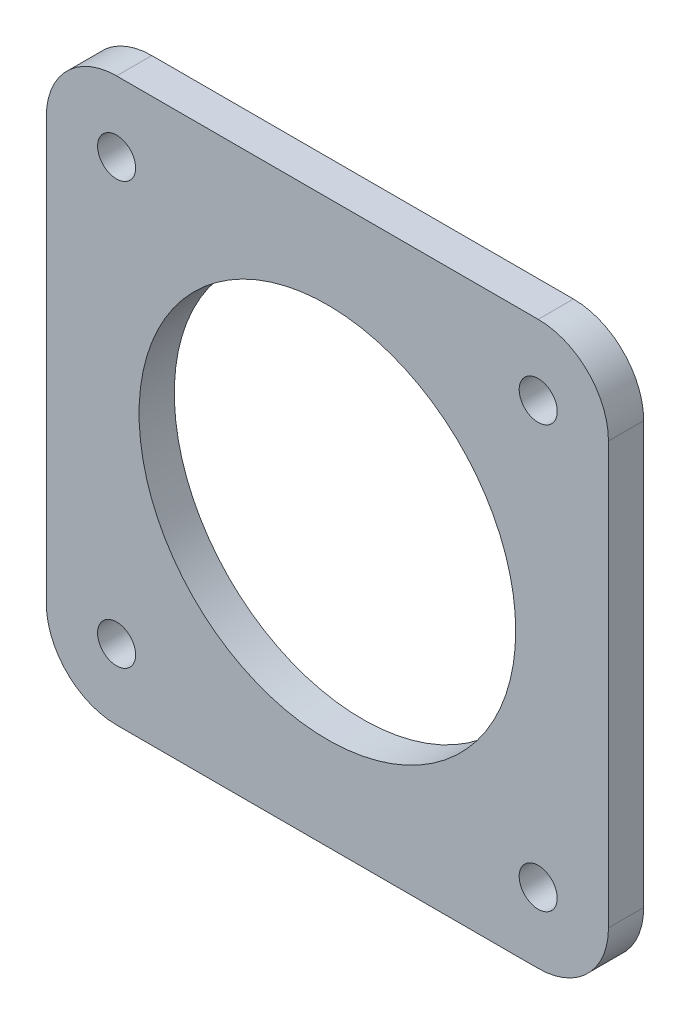
ISO-10303-21;
HEADER;
FILE_DESCRIPTION(('STEP AP214'),'2;1');
FILE_NAME('part.step','',(''),(''),'','','');
FILE_SCHEMA(('AUTOMOTIVE_DESIGN { 1 0 10303 214 1 1 1 1 }'));
ENDSEC;
DATA;
#1=APPLICATION_CONTEXT('core data for automotive mechanical design processes');
#2=APPLICATION_PROTOCOL_DEFINITION('international standard','automotive_design',2000,#1);
#3=PRODUCT_CONTEXT('',#1,'mechanical');
#4=PRODUCT('Part','Part','',(#3));
#5=PRODUCT_RELATED_PRODUCT_CATEGORY('part','',(#4));
#6=PRODUCT_DEFINITION_FORMATION('','',#4);
#7=PRODUCT_DEFINITION_CONTEXT('part definition',#1,'design');
#8=PRODUCT_DEFINITION('design','',#6,#7);
#9=PRODUCT_DEFINITION_SHAPE('','',#8);
#10=(LENGTH_UNIT() NAMED_UNIT(*) SI_UNIT(.MILLI.,.METRE.));
#11=(NAMED_UNIT(*) PLANE_ANGLE_UNIT() SI_UNIT($,.RADIAN.));
#12=(NAMED_UNIT(*) SI_UNIT($,.STERADIAN.) SOLID_ANGLE_UNIT());
#13=UNCERTAINTY_MEASURE_WITH_UNIT(LENGTH_MEASURE(1.E-05),#10,'distance_accuracy_value','');
#14=(GEOMETRIC_REPRESENTATION_CONTEXT(3) GLOBAL_UNCERTAINTY_ASSIGNED_CONTEXT((#13)) GLOBAL_UNIT_ASSIGNED_CONTEXT((#10,
#11,#12)) REPRESENTATION_CONTEXT('',''));
#15=CARTESIAN_POINT('',(0.,0.,0.));
#16=DIRECTION('',(0.,0.,1.));
#17=DIRECTION('',(1.,0.,0.));
#18=AXIS2_PLACEMENT_3D('',#15,#16,#17);
#19=CARTESIAN_POINT('',(28.575,28.575,-4.7752));
#20=DIRECTION('',(0.,0.,1.));
#21=DIRECTION('',(1.,0.,0.));
#22=AXIS2_PLACEMENT_3D('',#19,#20,#21);
#23=CYLINDRICAL_SURFACE('',#22,9.52500000000001);
#24=CARTESIAN_POINT('',(28.575,28.575,0.));
#25=DIRECTION('',(0.,0.,1.));
#26=DIRECTION('',(-1.,0.,0.));
#27=AXIS2_PLACEMENT_3D('',#24,#25,#26);
#28=CIRCLE('',#27,9.52500000000001);
#29=CARTESIAN_POINT('',(38.1,28.575,0.));
#30=VERTEX_POINT('',#29);
#31=CARTESIAN_POINT('',(28.575,38.1,0.));
#32=VERTEX_POINT('',#31);
#33=EDGE_CURVE('E131',#30,#32,#28,.T.);
#34=ORIENTED_EDGE('',*,*,#33,.F.);
#35=DIRECTION('',(0.,0.,1.));
#36=VECTOR('',#35,1.);
#37=CARTESIAN_POINT('',(38.1,28.575,-4.7752));
#38=LINE('',#37,#36);
#39=CARTESIAN_POINT('',(38.1,28.575,-4.7752));
#40=VERTEX_POINT('',#39);
#41=EDGE_CURVE('E11',#40,#30,#38,.T.);
#42=ORIENTED_EDGE('',*,*,#41,.F.);
#43=CARTESIAN_POINT('',(28.575,28.575,-4.7752));
#44=DIRECTION('',(0.,0.,1.));
#45=DIRECTION('',(-1.,0.,0.));
#46=AXIS2_PLACEMENT_3D('',#43,#44,#45);
#47=CIRCLE('',#46,9.52500000000001);
#48=CARTESIAN_POINT('',(28.575,38.1,-4.7752));
#49=VERTEX_POINT('',#48);
#50=EDGE_CURVE('E152',#40,#49,#47,.T.);
#51=ORIENTED_EDGE('',*,*,#50,.T.);
#52=DIRECTION('',(0.,0.,1.));
#53=VECTOR('',#52,1.);
#54=CARTESIAN_POINT('',(28.575,38.1,-4.7752));
#55=LINE('',#54,#53);
#56=EDGE_CURVE('E35',#49,#32,#55,.T.);
#57=ORIENTED_EDGE('',*,*,#56,.T.);
#58=EDGE_LOOP('',(#34,#42,#51,#57));
#59=FACE_BOUND('',#58,.T.);
#60=ADVANCED_FACE('F32',(#59),#23,.T.);
#61=CARTESIAN_POINT('',(38.1,28.575,-4.7752));
#62=DIRECTION('',(1.,0.,0.));
#63=DIRECTION('',(0.,0.,-1.));
#64=AXIS2_PLACEMENT_3D('',#61,#62,#63);
#65=PLANE('',#64);
#66=DIRECTION('',(0.,1.,0.));
#67=VECTOR('',#66,1.);
#68=CARTESIAN_POINT('',(38.1,28.575,0.));
#69=LINE('',#68,#67);
#70=CARTESIAN_POINT('',(38.1,-28.575,0.));
#71=VERTEX_POINT('',#70);
#72=EDGE_CURVE('E150',#71,#30,#69,.T.);
#73=ORIENTED_EDGE('',*,*,#72,.F.);
#74=DIRECTION('',(0.,0.,1.));
#75=VECTOR('',#74,1.);
#76=CARTESIAN_POINT('',(38.1,-28.575,-4.7752));
#77=LINE('',#76,#75);
#78=CARTESIAN_POINT('',(38.1,-28.575,-4.7752));
#79=VERTEX_POINT('',#78);
#80=EDGE_CURVE('E41',#79,#71,#77,.T.);
#81=ORIENTED_EDGE('',*,*,#80,.F.);
#82=DIRECTION('',(0.,1.,0.));
#83=VECTOR('',#82,1.);
#84=CARTESIAN_POINT('',(38.1,28.575,-4.7752));
#85=LINE('',#84,#83);
#86=EDGE_CURVE('E119',#79,#40,#85,.T.);
#87=ORIENTED_EDGE('',*,*,#86,.T.);
#88=ORIENTED_EDGE('',*,*,#41,.T.);
#89=EDGE_LOOP('',(#73,#81,#87,#88));
#90=FACE_BOUND('',#89,.T.);
#91=ADVANCED_FACE('F164',(#90),#65,.T.);
#92=CARTESIAN_POINT('',(28.575,-28.575,-4.7752));
#93=DIRECTION('',(0.,0.,1.));
#94=DIRECTION('',(1.,0.,0.));
#95=AXIS2_PLACEMENT_3D('',#92,#93,#94);
#96=CYLINDRICAL_SURFACE('',#95,9.52500000000001);
#97=CARTESIAN_POINT('',(28.575,-28.575,0.));
#98=DIRECTION('',(0.,0.,1.));
#99=DIRECTION('',(1.,0.,0.));
#100=AXIS2_PLACEMENT_3D('',#97,#98,#99);
#101=CIRCLE('',#100,9.52500000000001);
#102=CARTESIAN_POINT('',(28.575,-38.1,0.));
#103=VERTEX_POINT('',#102);
#104=EDGE_CURVE('E106',#103,#71,#101,.T.);
#105=ORIENTED_EDGE('',*,*,#104,.F.);
#106=DIRECTION('',(0.,0.,1.));
#107=VECTOR('',#106,1.);
#108=CARTESIAN_POINT('',(28.575,-38.1,-4.7752));
#109=LINE('',#108,#107);
#110=CARTESIAN_POINT('',(28.575,-38.1,-4.7752));
#111=VERTEX_POINT('',#110);
#112=EDGE_CURVE('E101',#111,#103,#109,.T.);
#113=ORIENTED_EDGE('',*,*,#112,.F.);
#114=CARTESIAN_POINT('',(28.575,-28.575,-4.7752));
#115=DIRECTION('',(0.,0.,1.));
#116=DIRECTION('',(1.,0.,0.));
#117=AXIS2_PLACEMENT_3D('',#114,#115,#116);
#118=CIRCLE('',#117,9.52500000000001);
#119=EDGE_CURVE('E104',#111,#79,#118,.T.);
#120=ORIENTED_EDGE('',*,*,#119,.T.);
#121=ORIENTED_EDGE('',*,*,#80,.T.);
#122=EDGE_LOOP('',(#105,#113,#120,#121));
#123=FACE_BOUND('',#122,.T.);
#124=ADVANCED_FACE('F103',(#123),#96,.T.);
#125=CARTESIAN_POINT('',(-28.575,-38.1,-4.7752));
#126=DIRECTION('',(0.,-1.,0.));
#127=DIRECTION('',(0.,0.,-1.));
#128=AXIS2_PLACEMENT_3D('',#125,#126,#127);
#129=PLANE('',#128);
#130=DIRECTION('',(1.,0.,0.));
#131=VECTOR('',#130,1.);
#132=CARTESIAN_POINT('',(-28.575,-38.1,0.));
#133=LINE('',#132,#131);
#134=CARTESIAN_POINT('',(-28.575,-38.1,0.));
#135=VERTEX_POINT('',#134);
#136=EDGE_CURVE('E147',#135,#103,#133,.T.);
#137=ORIENTED_EDGE('',*,*,#136,.F.);
#138=DIRECTION('',(0.,0.,1.));
#139=VECTOR('',#138,1.);
#140=CARTESIAN_POINT('',(-28.575,-38.1,-4.7752));
#141=LINE('',#140,#139);
#142=CARTESIAN_POINT('',(-28.575,-38.1,-4.7752));
#143=VERTEX_POINT('',#142);
#144=EDGE_CURVE('E111',#143,#135,#141,.T.);
#145=ORIENTED_EDGE('',*,*,#144,.F.);
#146=DIRECTION('',(1.,0.,0.));
#147=VECTOR('',#146,1.);
#148=CARTESIAN_POINT('',(-28.575,-38.1,-4.7752));
#149=LINE('',#148,#147);
#150=EDGE_CURVE('E117',#143,#111,#149,.T.);
#151=ORIENTED_EDGE('',*,*,#150,.T.);
#152=ORIENTED_EDGE('',*,*,#112,.T.);
#153=EDGE_LOOP('',(#137,#145,#151,#152));
#154=FACE_BOUND('',#153,.T.);
#155=ADVANCED_FACE('F122',(#154),#129,.T.);
#156=CARTESIAN_POINT('',(-28.575,-28.575,-4.7752));
#157=DIRECTION('',(0.,0.,1.));
#158=DIRECTION('',(1.,0.,0.));
#159=AXIS2_PLACEMENT_3D('',#156,#157,#158);
#160=CYLINDRICAL_SURFACE('',#159,9.52500000000001);
#161=CARTESIAN_POINT('',(-28.575,-28.575,0.));
#162=DIRECTION('',(0.,0.,1.));
#163=DIRECTION('',(1.,0.,0.));
#164=AXIS2_PLACEMENT_3D('',#161,#162,#163);
#165=CIRCLE('',#164,9.52500000000001);
#166=CARTESIAN_POINT('',(-38.1,-28.575,0.));
#167=VERTEX_POINT('',#166);
#168=EDGE_CURVE('E144',#167,#135,#165,.T.);
#169=ORIENTED_EDGE('',*,*,#168,.F.);
#170=DIRECTION('',(0.,0.,1.));
#171=VECTOR('',#170,1.);
#172=CARTESIAN_POINT('',(-38.1,-28.575,-4.7752));
#173=LINE('',#172,#171);
#174=CARTESIAN_POINT('',(-38.1,-28.575,-4.7752));
#175=VERTEX_POINT('',#174);
#176=EDGE_CURVE('E156',#175,#167,#173,.T.);
#177=ORIENTED_EDGE('',*,*,#176,.F.);
#178=CARTESIAN_POINT('',(-28.575,-28.575,-4.7752));
#179=DIRECTION('',(0.,0.,1.));
#180=DIRECTION('',(1.,0.,0.));
#181=AXIS2_PLACEMENT_3D('',#178,#179,#180);
#182=CIRCLE('',#181,9.52500000000001);
#183=EDGE_CURVE('E123',#175,#143,#182,.T.);
#184=ORIENTED_EDGE('',*,*,#183,.T.);
#185=ORIENTED_EDGE('',*,*,#144,.T.);
#186=EDGE_LOOP('',(#169,#177,#184,#185));
#187=FACE_BOUND('',#186,.T.);
#188=ADVANCED_FACE('F177',(#187),#160,.T.);
#189=CARTESIAN_POINT('',(-38.1,28.575,-4.7752));
#190=DIRECTION('',(-1.,0.,0.));
#191=DIRECTION('',(0.,0.,1.));
#192=AXIS2_PLACEMENT_3D('',#189,#190,#191);
#193=PLANE('',#192);
#194=DIRECTION('',(0.,-1.,0.));
#195=VECTOR('',#194,1.);
#196=CARTESIAN_POINT('',(-38.1,28.575,0.));
#197=LINE('',#196,#195);
#198=CARTESIAN_POINT('',(-38.1,28.575,0.));
#199=VERTEX_POINT('',#198);
#200=EDGE_CURVE('E141',#199,#167,#197,.T.);
#201=ORIENTED_EDGE('',*,*,#200,.F.);
#202=DIRECTION('',(0.,0.,1.));
#203=VECTOR('',#202,1.);
#204=CARTESIAN_POINT('',(-38.1,28.575,-4.7752));
#205=LINE('',#204,#203);
#206=CARTESIAN_POINT('',(-38.1,28.575,-4.7752));
#207=VERTEX_POINT('',#206);
#208=EDGE_CURVE('E158',#207,#199,#205,.T.);
#209=ORIENTED_EDGE('',*,*,#208,.F.);
#210=DIRECTION('',(0.,-1.,0.));
#211=VECTOR('',#210,1.);
#212=CARTESIAN_POINT('',(-38.1,28.575,-4.7752));
#213=LINE('',#212,#211);
#214=EDGE_CURVE('E125',#207,#175,#213,.T.);
#215=ORIENTED_EDGE('',*,*,#214,.T.);
#216=ORIENTED_EDGE('',*,*,#176,.T.);
#217=EDGE_LOOP('',(#201,#209,#215,#216));
#218=FACE_BOUND('',#217,.T.);
#219=ADVANCED_FACE('F180',(#218),#193,.T.);
#220=CARTESIAN_POINT('',(-28.575,28.575,-4.7752));
#221=DIRECTION('',(0.,0.,1.));
#222=DIRECTION('',(1.,0.,0.));
#223=AXIS2_PLACEMENT_3D('',#220,#221,#222);
#224=CYLINDRICAL_SURFACE('',#223,9.52500000000001);
#225=CARTESIAN_POINT('',(-28.575,28.575,0.));
#226=DIRECTION('',(0.,0.,1.));
#227=DIRECTION('',(1.,0.,0.));
#228=AXIS2_PLACEMENT_3D('',#225,#226,#227);
#229=CIRCLE('',#228,9.52500000000001);
#230=CARTESIAN_POINT('',(-28.575,38.1,0.));
#231=VERTEX_POINT('',#230);
#232=EDGE_CURVE('E138',#231,#199,#229,.T.);
#233=ORIENTED_EDGE('',*,*,#232,.F.);
#234=DIRECTION('',(0.,0.,1.));
#235=VECTOR('',#234,1.);
#236=CARTESIAN_POINT('',(-28.575,38.1,-4.7752));
#237=LINE('',#236,#235);
#238=CARTESIAN_POINT('',(-28.575,38.1,-4.7752));
#239=VERTEX_POINT('',#238);
#240=EDGE_CURVE('E159',#239,#231,#237,.T.);
#241=ORIENTED_EDGE('',*,*,#240,.F.);
#242=CARTESIAN_POINT('',(-28.575,28.575,-4.7752));
#243=DIRECTION('',(0.,0.,1.));
#244=DIRECTION('',(1.,0.,0.));
#245=AXIS2_PLACEMENT_3D('',#242,#243,#244);
#246=CIRCLE('',#245,9.52500000000001);
#247=EDGE_CURVE('E262',#239,#207,#246,.T.);
#248=ORIENTED_EDGE('',*,*,#247,.T.);
#249=ORIENTED_EDGE('',*,*,#208,.T.);
#250=EDGE_LOOP('',(#233,#241,#248,#249));
#251=FACE_BOUND('',#250,.T.);
#252=ADVANCED_FACE('F184',(#251),#224,.T.);
#253=CARTESIAN_POINT('',(-28.575,38.1,-4.7752));
#254=DIRECTION('',(0.,1.,0.));
#255=DIRECTION('',(0.,0.,1.));
#256=AXIS2_PLACEMENT_3D('',#253,#254,#255);
#257=PLANE('',#256);
#258=DIRECTION('',(-1.,0.,0.));
#259=VECTOR('',#258,1.);
#260=CARTESIAN_POINT('',(-28.575,38.1,0.));
#261=LINE('',#260,#259);
#262=EDGE_CURVE('E134',#32,#231,#261,.T.);
#263=ORIENTED_EDGE('',*,*,#262,.F.);
#264=ORIENTED_EDGE('',*,*,#56,.F.);
#265=DIRECTION('',(-1.,0.,0.));
#266=VECTOR('',#265,1.);
#267=CARTESIAN_POINT('',(-28.575,38.1,-4.7752));
#268=LINE('',#267,#266);
#269=EDGE_CURVE('E260',#49,#239,#268,.T.);
#270=ORIENTED_EDGE('',*,*,#269,.T.);
#271=ORIENTED_EDGE('',*,*,#240,.T.);
#272=EDGE_LOOP('',(#263,#264,#270,#271));
#273=FACE_BOUND('',#272,.T.);
#274=ADVANCED_FACE('F161',(#273),#257,.T.);
#275=CARTESIAN_POINT('',(28.575,28.575,-4.7752));
#276=DIRECTION('',(0.,0.,-1.));
#277=DIRECTION('',(-1.,0.,0.));
#278=AXIS2_PLACEMENT_3D('',#275,#276,#277);
#279=PLANE('',#278);
#280=CARTESIAN_POINT('',(28.575,-28.575,-4.7752));
#281=DIRECTION('',(0.,0.,1.));
#282=DIRECTION('',(1.,0.,0.));
#283=AXIS2_PLACEMENT_3D('',#280,#281,#282);
#284=CIRCLE('',#283,2.5781);
#285=CARTESIAN_POINT('',(31.1531,-28.575,-4.7752));
#286=VERTEX_POINT('',#285);
#287=EDGE_CURVE('E223',#286,#286,#284,.T.);
#288=ORIENTED_EDGE('',*,*,#287,.T.);
#289=EDGE_LOOP('',(#288));
#290=FACE_BOUND('',#289,.T.);
#291=CARTESIAN_POINT('',(-28.575,-28.575,-4.7752));
#292=DIRECTION('',(0.,0.,1.));
#293=DIRECTION('',(-1.,0.,0.));
#294=AXIS2_PLACEMENT_3D('',#291,#292,#293);
#295=CIRCLE('',#294,2.5781);
#296=CARTESIAN_POINT('',(-31.1531,-28.575,-4.7752));
#297=VERTEX_POINT('',#296);
#298=EDGE_CURVE('E232',#297,#297,#295,.T.);
#299=ORIENTED_EDGE('',*,*,#298,.T.);
#300=EDGE_LOOP('',(#299));
#301=FACE_BOUND('',#300,.T.);
#302=CARTESIAN_POINT('',(28.575,28.575,-4.7752));
#303=DIRECTION('',(0.,0.,1.));
#304=DIRECTION('',(-1.,0.,0.));
#305=AXIS2_PLACEMENT_3D('',#302,#303,#304);
#306=CIRCLE('',#305,2.5781);
#307=CARTESIAN_POINT('',(25.9969,28.575,-4.7752));
#308=VERTEX_POINT('',#307);
#309=EDGE_CURVE('E239',#308,#308,#306,.T.);
#310=ORIENTED_EDGE('',*,*,#309,.T.);
#311=EDGE_LOOP('',(#310));
#312=FACE_BOUND('',#311,.T.);
#313=CARTESIAN_POINT('',(-28.575,28.575,-4.7752));
#314=DIRECTION('',(0.,0.,1.));
#315=DIRECTION('',(1.,0.,0.));
#316=AXIS2_PLACEMENT_3D('',#313,#314,#315);
#317=CIRCLE('',#316,2.5781);
#318=CARTESIAN_POINT('',(-25.9969,28.575,-4.7752));
#319=VERTEX_POINT('',#318);
#320=EDGE_CURVE('E246',#319,#319,#317,.T.);
#321=ORIENTED_EDGE('',*,*,#320,.T.);
#322=EDGE_LOOP('',(#321));
#323=FACE_BOUND('',#322,.T.);
#324=CARTESIAN_POINT('',(0.,0.,-4.7752));
#325=DIRECTION('',(0.,0.,1.));
#326=DIRECTION('',(1.,0.,0.));
#327=AXIS2_PLACEMENT_3D('',#324,#325,#326);
#328=CIRCLE('',#327,25.527);
#329=CARTESIAN_POINT('',(25.527,0.,-4.7752));
#330=VERTEX_POINT('',#329);
#331=EDGE_CURVE('E135',#330,#330,#328,.T.);
#332=ORIENTED_EDGE('',*,*,#331,.T.);
#333=EDGE_LOOP('',(#332));
#334=FACE_BOUND('',#333,.T.);
#335=ORIENTED_EDGE('',*,*,#50,.F.);
#336=ORIENTED_EDGE('',*,*,#86,.F.);
#337=ORIENTED_EDGE('',*,*,#119,.F.);
#338=ORIENTED_EDGE('',*,*,#150,.F.);
#339=ORIENTED_EDGE('',*,*,#183,.F.);
#340=ORIENTED_EDGE('',*,*,#214,.F.);
#341=ORIENTED_EDGE('',*,*,#247,.F.);
#342=ORIENTED_EDGE('',*,*,#269,.F.);
#343=EDGE_LOOP('',(#335,#336,#337,#338,#339,#340,#341,#342));
#344=FACE_BOUND('',#343,.T.);
#345=ADVANCED_FACE('F115',(#290,#301,#312,#323,#334,#344),#279,.T.);
#346=CARTESIAN_POINT('',(28.575,28.575,0.));
#347=DIRECTION('',(0.,0.,-1.));
#348=DIRECTION('',(-1.,0.,0.));
#349=AXIS2_PLACEMENT_3D('',#346,#347,#348);
#350=PLANE('',#349);
#351=CARTESIAN_POINT('',(28.575,-28.575,0.));
#352=DIRECTION('',(0.,0.,1.));
#353=DIRECTION('',(1.,0.,0.));
#354=AXIS2_PLACEMENT_3D('',#351,#352,#353);
#355=CIRCLE('',#354,2.5781);
#356=CARTESIAN_POINT('',(31.1531,-28.575,0.));
#357=VERTEX_POINT('',#356);
#358=EDGE_CURVE('E226',#357,#357,#355,.T.);
#359=ORIENTED_EDGE('',*,*,#358,.F.);
#360=EDGE_LOOP('',(#359));
#361=FACE_BOUND('',#360,.T.);
#362=CARTESIAN_POINT('',(-28.575,-28.575,0.));
#363=DIRECTION('',(0.,0.,1.));
#364=DIRECTION('',(-1.,0.,0.));
#365=AXIS2_PLACEMENT_3D('',#362,#363,#364);
#366=CIRCLE('',#365,2.5781);
#367=CARTESIAN_POINT('',(-31.1531,-28.575,0.));
#368=VERTEX_POINT('',#367);
#369=EDGE_CURVE('E229',#368,#368,#366,.T.);
#370=ORIENTED_EDGE('',*,*,#369,.F.);
#371=EDGE_LOOP('',(#370));
#372=FACE_BOUND('',#371,.T.);
#373=CARTESIAN_POINT('',(28.575,28.575,0.));
#374=DIRECTION('',(0.,0.,1.));
#375=DIRECTION('',(-1.,0.,0.));
#376=AXIS2_PLACEMENT_3D('',#373,#374,#375);
#377=CIRCLE('',#376,2.5781);
#378=CARTESIAN_POINT('',(25.9969,28.575,0.));
#379=VERTEX_POINT('',#378);
#380=EDGE_CURVE('E236',#379,#379,#377,.T.);
#381=ORIENTED_EDGE('',*,*,#380,.F.);
#382=EDGE_LOOP('',(#381));
#383=FACE_BOUND('',#382,.T.);
#384=CARTESIAN_POINT('',(-28.575,28.575,0.));
#385=DIRECTION('',(0.,0.,1.));
#386=DIRECTION('',(1.,0.,0.));
#387=AXIS2_PLACEMENT_3D('',#384,#385,#386);
#388=CIRCLE('',#387,2.5781);
#389=CARTESIAN_POINT('',(-25.9969,28.575,0.));
#390=VERTEX_POINT('',#389);
#391=EDGE_CURVE('E243',#390,#390,#388,.T.);
#392=ORIENTED_EDGE('',*,*,#391,.F.);
#393=EDGE_LOOP('',(#392));
#394=FACE_BOUND('',#393,.T.);
#395=CARTESIAN_POINT('',(0.,0.,0.));
#396=DIRECTION('',(0.,0.,1.));
#397=DIRECTION('',(1.,0.,0.));
#398=AXIS2_PLACEMENT_3D('',#395,#396,#397);
#399=CIRCLE('',#398,25.527);
#400=CARTESIAN_POINT('',(25.527,0.,0.));
#401=VERTEX_POINT('',#400);
#402=EDGE_CURVE('E250',#401,#401,#399,.T.);
#403=ORIENTED_EDGE('',*,*,#402,.F.);
#404=EDGE_LOOP('',(#403));
#405=FACE_BOUND('',#404,.T.);
#406=ORIENTED_EDGE('',*,*,#33,.T.);
#407=ORIENTED_EDGE('',*,*,#262,.T.);
#408=ORIENTED_EDGE('',*,*,#232,.T.);
#409=ORIENTED_EDGE('',*,*,#200,.T.);
#410=ORIENTED_EDGE('',*,*,#168,.T.);
#411=ORIENTED_EDGE('',*,*,#136,.T.);
#412=ORIENTED_EDGE('',*,*,#104,.T.);
#413=ORIENTED_EDGE('',*,*,#72,.T.);
#414=EDGE_LOOP('',(#406,#407,#408,#409,#410,#411,#412,#413));
#415=FACE_BOUND('',#414,.T.);
#416=ADVANCED_FACE('F163',(#361,#372,#383,#394,#405,#415),#350,.F.);
#417=CARTESIAN_POINT('',(0.,0.,-4.7752));
#418=DIRECTION('',(0.,0.,1.));
#419=DIRECTION('',(1.,0.,0.));
#420=AXIS2_PLACEMENT_3D('',#417,#418,#419);
#421=CYLINDRICAL_SURFACE('',#420,25.527);
#422=ORIENTED_EDGE('',*,*,#331,.F.);
#423=EDGE_LOOP('',(#422));
#424=FACE_BOUND('',#423,.T.);
#425=ORIENTED_EDGE('',*,*,#402,.T.);
#426=EDGE_LOOP('',(#425));
#427=FACE_BOUND('',#426,.T.);
#428=ADVANCED_FACE('F196',(#424,#427),#421,.F.);
#429=CARTESIAN_POINT('',(-28.575,28.575,-4.7752));
#430=DIRECTION('',(0.,0.,1.));
#431=DIRECTION('',(1.,0.,0.));
#432=AXIS2_PLACEMENT_3D('',#429,#430,#431);
#433=CYLINDRICAL_SURFACE('',#432,2.5781);
#434=ORIENTED_EDGE('',*,*,#320,.F.);
#435=EDGE_LOOP('',(#434));
#436=FACE_BOUND('',#435,.T.);
#437=ORIENTED_EDGE('',*,*,#391,.T.);
#438=EDGE_LOOP('',(#437));
#439=FACE_BOUND('',#438,.T.);
#440=ADVANCED_FACE('F203',(#436,#439),#433,.F.);
#441=CARTESIAN_POINT('',(28.575,28.575,-4.7752));
#442=DIRECTION('',(0.,0.,1.));
#443=DIRECTION('',(1.,0.,0.));
#444=AXIS2_PLACEMENT_3D('',#441,#442,#443);
#445=CYLINDRICAL_SURFACE('',#444,2.5781);
#446=ORIENTED_EDGE('',*,*,#309,.F.);
#447=EDGE_LOOP('',(#446));
#448=FACE_BOUND('',#447,.T.);
#449=ORIENTED_EDGE('',*,*,#380,.T.);
#450=EDGE_LOOP('',(#449));
#451=FACE_BOUND('',#450,.T.);
#452=ADVANCED_FACE('F207',(#448,#451),#445,.F.);
#453=CARTESIAN_POINT('',(-28.575,-28.575,-4.7752));
#454=DIRECTION('',(0.,0.,1.));
#455=DIRECTION('',(1.,0.,0.));
#456=AXIS2_PLACEMENT_3D('',#453,#454,#455);
#457=CYLINDRICAL_SURFACE('',#456,2.5781);
#458=ORIENTED_EDGE('',*,*,#298,.F.);
#459=EDGE_LOOP('',(#458));
#460=FACE_BOUND('',#459,.T.);
#461=ORIENTED_EDGE('',*,*,#369,.T.);
#462=EDGE_LOOP('',(#461));
#463=FACE_BOUND('',#462,.T.);
#464=ADVANCED_FACE('F211',(#460,#463),#457,.F.);
#465=CARTESIAN_POINT('',(28.575,-28.575,-4.7752));
#466=DIRECTION('',(0.,0.,1.));
#467=DIRECTION('',(1.,0.,0.));
#468=AXIS2_PLACEMENT_3D('',#465,#466,#467);
#469=CYLINDRICAL_SURFACE('',#468,2.5781);
#470=ORIENTED_EDGE('',*,*,#287,.F.);
#471=EDGE_LOOP('',(#470));
#472=FACE_BOUND('',#471,.T.);
#473=ORIENTED_EDGE('',*,*,#358,.T.);
#474=EDGE_LOOP('',(#473));
#475=FACE_BOUND('',#474,.T.);
#476=ADVANCED_FACE('F215',(#472,#475),#469,.F.);
#477=CLOSED_SHELL('',(#60,#91,#124,#155,#188,#219,#252,#274,#345,#416,#428,#440,#452,#464,#476));
#478=MANIFOLD_SOLID_BREP('B2',#477);
#479=ADVANCED_BREP_SHAPE_REPRESENTATION('',(#18,#478),#14);
#480=SHAPE_DEFINITION_REPRESENTATION(#9,#479);
ENDSEC;
END-ISO-10303-21;
